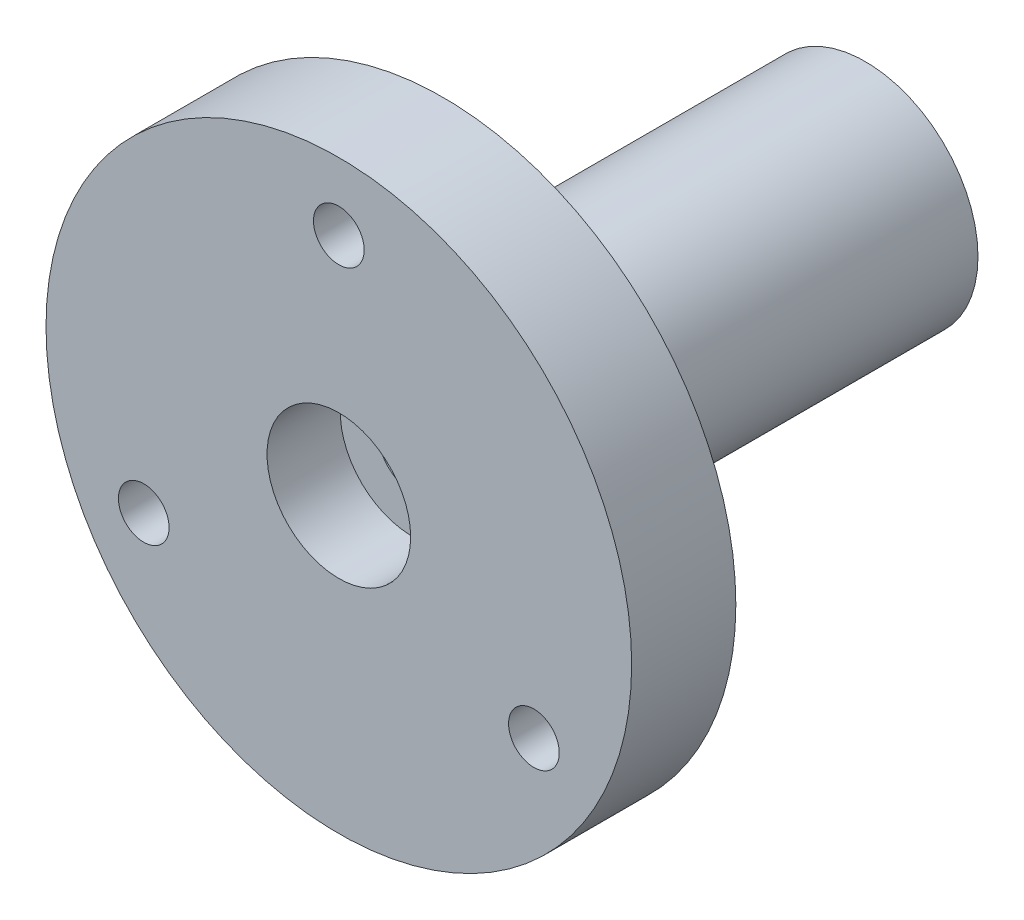
ISO-10303-21;
HEADER;
FILE_DESCRIPTION(('STEP AP214'),'2;1');
FILE_NAME('part.step','',(''),(''),'','','');
FILE_SCHEMA(('AUTOMOTIVE_DESIGN { 1 0 10303 214 1 1 1 1 }'));
ENDSEC;
DATA;
#1=APPLICATION_CONTEXT('core data for automotive mechanical design processes');
#2=APPLICATION_PROTOCOL_DEFINITION('international standard','automotive_design',2000,#1);
#3=PRODUCT_CONTEXT('',#1,'mechanical');
#4=PRODUCT('Part','Part','',(#3));
#5=PRODUCT_RELATED_PRODUCT_CATEGORY('part','',(#4));
#6=PRODUCT_DEFINITION_FORMATION('','',#4);
#7=PRODUCT_DEFINITION_CONTEXT('part definition',#1,'design');
#8=PRODUCT_DEFINITION('design','',#6,#7);
#9=PRODUCT_DEFINITION_SHAPE('','',#8);
#10=(LENGTH_UNIT() NAMED_UNIT(*) SI_UNIT(.MILLI.,.METRE.));
#11=(NAMED_UNIT(*) PLANE_ANGLE_UNIT() SI_UNIT($,.RADIAN.));
#12=(NAMED_UNIT(*) SI_UNIT($,.STERADIAN.) SOLID_ANGLE_UNIT());
#13=UNCERTAINTY_MEASURE_WITH_UNIT(LENGTH_MEASURE(1.E-05),#10,'distance_accuracy_value','');
#14=(GEOMETRIC_REPRESENTATION_CONTEXT(3) GLOBAL_UNCERTAINTY_ASSIGNED_CONTEXT((#13)) GLOBAL_UNIT_ASSIGNED_CONTEXT((#10,
#11,#12)) REPRESENTATION_CONTEXT('',''));
#15=CARTESIAN_POINT('',(0.,0.,0.));
#16=DIRECTION('',(0.,0.,1.));
#17=DIRECTION('',(1.,0.,0.));
#18=AXIS2_PLACEMENT_3D('',#15,#16,#17);
#19=CARTESIAN_POINT('',(0.,0.,3.7));
#20=DIRECTION('',(0.,0.,-1.));
#21=DIRECTION('',(-1.,0.,0.));
#22=AXIS2_PLACEMENT_3D('',#19,#20,#21);
#23=CYLINDRICAL_SURFACE('',#22,1.2);
#24=CARTESIAN_POINT('',(0.,0.,1.1));
#25=DIRECTION('',(0.,0.,1.));
#26=DIRECTION('',(1.,0.,0.));
#27=AXIS2_PLACEMENT_3D('',#24,#25,#26);
#28=CIRCLE('',#27,1.2);
#29=CARTESIAN_POINT('',(1.2,0.,1.1));
#30=VERTEX_POINT('',#29);
#31=EDGE_CURVE('E41',#30,#30,#28,.F.);
#32=ORIENTED_EDGE('',*,*,#31,.F.);
#33=EDGE_LOOP('',(#32));
#34=FACE_BOUND('',#33,.T.);
#35=CARTESIAN_POINT('',(0.,0.,-15.));
#36=DIRECTION('',(0.,0.,-1.));
#37=DIRECTION('',(-1.,0.,0.));
#38=AXIS2_PLACEMENT_3D('',#35,#36,#37);
#39=CIRCLE('',#38,1.2);
#40=CARTESIAN_POINT('',(-1.2,0.,-15.));
#41=VERTEX_POINT('',#40);
#42=EDGE_CURVE('E325',#41,#41,#39,.T.);
#43=ORIENTED_EDGE('',*,*,#42,.T.);
#44=EDGE_LOOP('',(#43));
#45=FACE_BOUND('',#44,.T.);
#46=ADVANCED_FACE('F37',(#34,#45),#23,.F.);
#47=CARTESIAN_POINT('',(6.92820323027555,-3.99999999999994,3.7));
#48=DIRECTION('',(0.,0.,-1.));
#49=DIRECTION('',(-1.,0.,0.));
#50=AXIS2_PLACEMENT_3D('',#47,#48,#49);
#51=CYLINDRICAL_SURFACE('',#50,0.9);
#52=CARTESIAN_POINT('',(6.92820323027555,-3.99999999999994,3.7));
#53=DIRECTION('',(0.,0.,-1.));
#54=DIRECTION('',(0.499999999999992,0.866025403784443,0.));
#55=AXIS2_PLACEMENT_3D('',#52,#53,#54);
#56=CIRCLE('',#55,0.9);
#57=CARTESIAN_POINT('',(7.37820323027554,-3.22057713659394,3.7));
#58=VERTEX_POINT('',#57);
#59=EDGE_CURVE('E79',#58,#58,#56,.T.);
#60=ORIENTED_EDGE('',*,*,#59,.F.);
#61=EDGE_LOOP('',(#60));
#62=FACE_BOUND('',#61,.T.);
#63=CARTESIAN_POINT('',(6.92820323027555,-3.99999999999994,1.5));
#64=DIRECTION('',(0.,0.,-1.));
#65=DIRECTION('',(-1.,0.,0.));
#66=AXIS2_PLACEMENT_3D('',#63,#64,#65);
#67=CIRCLE('',#66,0.9);
#68=CARTESIAN_POINT('',(6.02820323027555,-3.99999999999994,1.5));
#69=VERTEX_POINT('',#68);
#70=EDGE_CURVE('E82',#69,#69,#67,.F.);
#71=ORIENTED_EDGE('',*,*,#70,.F.);
#72=EDGE_LOOP('',(#71));
#73=FACE_BOUND('',#72,.T.);
#74=ADVANCED_FACE('F102',(#62,#73),#51,.F.);
#75=CARTESIAN_POINT('',(-6.92820323027549,-4.00000000000003,3.7));
#76=DIRECTION('',(0.,0.,-1.));
#77=DIRECTION('',(-1.,0.,0.));
#78=AXIS2_PLACEMENT_3D('',#75,#76,#77);
#79=CYLINDRICAL_SURFACE('',#78,0.9);
#80=CARTESIAN_POINT('',(-6.92820323027549,-4.00000000000003,3.7));
#81=DIRECTION('',(0.,0.,-1.));
#82=DIRECTION('',(0.500000000000004,-0.866025403784436,0.));
#83=AXIS2_PLACEMENT_3D('',#80,#81,#82);
#84=CIRCLE('',#83,0.9);
#85=CARTESIAN_POINT('',(-6.47820323027549,-4.77942286340603,3.7));
#86=VERTEX_POINT('',#85);
#87=EDGE_CURVE('E75',#86,#86,#84,.T.);
#88=ORIENTED_EDGE('',*,*,#87,.F.);
#89=EDGE_LOOP('',(#88));
#90=FACE_BOUND('',#89,.T.);
#91=CARTESIAN_POINT('',(-6.92820323027549,-4.00000000000003,1.5));
#92=DIRECTION('',(0.,0.,-1.));
#93=DIRECTION('',(-1.,0.,0.));
#94=AXIS2_PLACEMENT_3D('',#91,#92,#93);
#95=CIRCLE('',#94,0.9);
#96=CARTESIAN_POINT('',(-7.82820323027549,-4.00000000000003,1.5));
#97=VERTEX_POINT('',#96);
#98=EDGE_CURVE('E65',#97,#97,#95,.F.);
#99=ORIENTED_EDGE('',*,*,#98,.F.);
#100=EDGE_LOOP('',(#99));
#101=FACE_BOUND('',#100,.T.);
#102=ADVANCED_FACE('F104',(#90,#101),#79,.F.);
#103=CARTESIAN_POINT('',(0.,8.,3.7));
#104=DIRECTION('',(0.,0.,-1.));
#105=DIRECTION('',(-1.,0.,0.));
#106=AXIS2_PLACEMENT_3D('',#103,#104,#105);
#107=CYLINDRICAL_SURFACE('',#106,0.9);
#108=CARTESIAN_POINT('',(0.,8.,3.7));
#109=DIRECTION('',(0.,0.,-1.));
#110=DIRECTION('',(-1.,0.,0.));
#111=AXIS2_PLACEMENT_3D('',#108,#109,#110);
#112=CIRCLE('',#111,0.9);
#113=CARTESIAN_POINT('',(-0.9,8.,3.7));
#114=VERTEX_POINT('',#113);
#115=EDGE_CURVE('E89',#114,#114,#112,.T.);
#116=ORIENTED_EDGE('',*,*,#115,.F.);
#117=EDGE_LOOP('',(#116));
#118=FACE_BOUND('',#117,.T.);
#119=CARTESIAN_POINT('',(0.,8.,1.5));
#120=DIRECTION('',(0.,0.,-1.));
#121=DIRECTION('',(-1.,0.,0.));
#122=AXIS2_PLACEMENT_3D('',#119,#120,#121);
#123=CIRCLE('',#122,0.9);
#124=CARTESIAN_POINT('',(-0.9,8.,1.5));
#125=VERTEX_POINT('',#124);
#126=EDGE_CURVE('E86',#125,#125,#123,.F.);
#127=ORIENTED_EDGE('',*,*,#126,.F.);
#128=EDGE_LOOP('',(#127));
#129=FACE_BOUND('',#128,.T.);
#130=ADVANCED_FACE('F111',(#118,#129),#107,.F.);
#131=CARTESIAN_POINT('',(0.,0.,3.7));
#132=DIRECTION('',(0.,0.,-1.));
#133=DIRECTION('',(-1.,0.,0.));
#134=AXIS2_PLACEMENT_3D('',#131,#132,#133);
#135=CYLINDRICAL_SURFACE('',#134,10.4);
#136=CARTESIAN_POINT('',(0.,0.,3.7));
#137=DIRECTION('',(0.,0.,1.));
#138=DIRECTION('',(1.,0.,0.));
#139=AXIS2_PLACEMENT_3D('',#136,#137,#138);
#140=CIRCLE('',#139,10.4);
#141=CARTESIAN_POINT('',(10.4,0.,3.7));
#142=VERTEX_POINT('',#141);
#143=EDGE_CURVE('E45',#142,#142,#140,.T.);
#144=ORIENTED_EDGE('',*,*,#143,.F.);
#145=EDGE_LOOP('',(#144));
#146=FACE_BOUND('',#145,.T.);
#147=CARTESIAN_POINT('',(0.,0.,0.));
#148=DIRECTION('',(0.,0.,1.));
#149=DIRECTION('',(1.,0.,0.));
#150=AXIS2_PLACEMENT_3D('',#147,#148,#149);
#151=CIRCLE('',#150,10.4);
#152=CARTESIAN_POINT('',(10.4,0.,0.));
#153=VERTEX_POINT('',#152);
#154=EDGE_CURVE('E50',#153,#153,#151,.T.);
#155=ORIENTED_EDGE('',*,*,#154,.T.);
#156=EDGE_LOOP('',(#155));
#157=FACE_BOUND('',#156,.T.);
#158=ADVANCED_FACE('F39',(#146,#157),#135,.T.);
#159=CARTESIAN_POINT('',(0.,0.,3.7));
#160=DIRECTION('',(0.,0.,1.));
#161=DIRECTION('',(1.,0.,0.));
#162=AXIS2_PLACEMENT_3D('',#159,#160,#161);
#163=PLANE('',#162);
#164=CARTESIAN_POINT('',(0.,0.,3.7));
#165=DIRECTION('',(0.,0.,1.));
#166=DIRECTION('',(1.,0.,0.));
#167=AXIS2_PLACEMENT_3D('',#164,#165,#166);
#168=CIRCLE('',#167,2.55);
#169=CARTESIAN_POINT('',(2.55,0.,3.7));
#170=VERTEX_POINT('',#169);
#171=EDGE_CURVE('E59',#170,#170,#168,.T.);
#172=ORIENTED_EDGE('',*,*,#171,.F.);
#173=EDGE_LOOP('',(#172));
#174=FACE_BOUND('',#173,.T.);
#175=ORIENTED_EDGE('',*,*,#87,.T.);
#176=EDGE_LOOP('',(#175));
#177=FACE_BOUND('',#176,.T.);
#178=ORIENTED_EDGE('',*,*,#59,.T.);
#179=EDGE_LOOP('',(#178));
#180=FACE_BOUND('',#179,.T.);
#181=ORIENTED_EDGE('',*,*,#115,.T.);
#182=EDGE_LOOP('',(#181));
#183=FACE_BOUND('',#182,.T.);
#184=ORIENTED_EDGE('',*,*,#143,.T.);
#185=EDGE_LOOP('',(#184));
#186=FACE_BOUND('',#185,.T.);
#187=ADVANCED_FACE('F132',(#174,#177,#180,#183,#186),#163,.T.);
#188=CARTESIAN_POINT('',(0.,0.,0.));
#189=DIRECTION('',(0.,0.,1.));
#190=DIRECTION('',(1.,0.,0.));
#191=AXIS2_PLACEMENT_3D('',#188,#189,#190);
#192=PLANE('',#191);
#193=CARTESIAN_POINT('',(0.,0.,0.));
#194=DIRECTION('',(0.,0.,-1.));
#195=DIRECTION('',(-1.,0.,0.));
#196=AXIS2_PLACEMENT_3D('',#193,#194,#195);
#197=CIRCLE('',#196,4.);
#198=CARTESIAN_POINT('',(-4.,0.,0.));
#199=VERTEX_POINT('',#198);
#200=EDGE_CURVE('E10',#199,#199,#197,.T.);
#201=ORIENTED_EDGE('',*,*,#200,.F.);
#202=EDGE_LOOP('',(#201));
#203=FACE_BOUND('',#202,.T.);
#204=CARTESIAN_POINT('',(-6.92820323027549,-4.00000000000003,0.));
#205=DIRECTION('',(0.,0.,-1.));
#206=DIRECTION('',(0.500000000000004,-0.866025403784436,0.));
#207=AXIS2_PLACEMENT_3D('',#204,#205,#206);
#208=CIRCLE('',#207,1.5);
#209=CARTESIAN_POINT('',(-6.17820323027549,-5.29903810567669,0.));
#210=VERTEX_POINT('',#209);
#211=EDGE_CURVE('E66',#210,#210,#208,.T.);
#212=ORIENTED_EDGE('',*,*,#211,.F.);
#213=EDGE_LOOP('',(#212));
#214=FACE_BOUND('',#213,.T.);
#215=CARTESIAN_POINT('',(6.92820323027555,-3.99999999999994,0.));
#216=DIRECTION('',(0.,0.,-1.));
#217=DIRECTION('',(0.499999999999992,0.866025403784443,0.));
#218=AXIS2_PLACEMENT_3D('',#215,#216,#217);
#219=CIRCLE('',#218,1.5);
#220=CARTESIAN_POINT('',(7.67820323027553,-2.70096189432327,0.));
#221=VERTEX_POINT('',#220);
#222=EDGE_CURVE('E72',#221,#221,#219,.T.);
#223=ORIENTED_EDGE('',*,*,#222,.F.);
#224=EDGE_LOOP('',(#223));
#225=FACE_BOUND('',#224,.T.);
#226=CARTESIAN_POINT('',(0.,8.,0.));
#227=DIRECTION('',(0.,0.,-1.));
#228=DIRECTION('',(-1.,0.,0.));
#229=AXIS2_PLACEMENT_3D('',#226,#227,#228);
#230=CIRCLE('',#229,1.5);
#231=CARTESIAN_POINT('',(-1.5,8.,0.));
#232=VERTEX_POINT('',#231);
#233=EDGE_CURVE('E78',#232,#232,#230,.T.);
#234=ORIENTED_EDGE('',*,*,#233,.F.);
#235=EDGE_LOOP('',(#234));
#236=FACE_BOUND('',#235,.T.);
#237=ORIENTED_EDGE('',*,*,#154,.F.);
#238=EDGE_LOOP('',(#237));
#239=FACE_BOUND('',#238,.T.);
#240=ADVANCED_FACE('F123',(#203,#214,#225,#236,#239),#192,.F.);
#241=CARTESIAN_POINT('',(0.,8.,1.5));
#242=DIRECTION('',(0.,0.,-1.));
#243=DIRECTION('',(-1.,0.,0.));
#244=AXIS2_PLACEMENT_3D('',#241,#242,#243);
#245=PLANE('',#244);
#246=CARTESIAN_POINT('',(0.,8.,1.5));
#247=DIRECTION('',(0.,0.,-1.));
#248=DIRECTION('',(-1.,0.,0.));
#249=AXIS2_PLACEMENT_3D('',#246,#247,#248);
#250=CIRCLE('',#249,1.5);
#251=CARTESIAN_POINT('',(-1.5,8.,1.5));
#252=VERTEX_POINT('',#251);
#253=EDGE_CURVE('E83',#252,#252,#250,.T.);
#254=ORIENTED_EDGE('',*,*,#253,.T.);
#255=EDGE_LOOP('',(#254));
#256=FACE_BOUND('',#255,.T.);
#257=ORIENTED_EDGE('',*,*,#126,.T.);
#258=EDGE_LOOP('',(#257));
#259=FACE_BOUND('',#258,.T.);
#260=ADVANCED_FACE('F119',(#256,#259),#245,.T.);
#261=CARTESIAN_POINT('',(0.,8.,1.5));
#262=DIRECTION('',(0.,0.,-1.));
#263=DIRECTION('',(-1.,0.,0.));
#264=AXIS2_PLACEMENT_3D('',#261,#262,#263);
#265=CYLINDRICAL_SURFACE('',#264,1.5);
#266=ORIENTED_EDGE('',*,*,#253,.F.);
#267=EDGE_LOOP('',(#266));
#268=FACE_BOUND('',#267,.T.);
#269=ORIENTED_EDGE('',*,*,#233,.T.);
#270=EDGE_LOOP('',(#269));
#271=FACE_BOUND('',#270,.T.);
#272=ADVANCED_FACE('F122',(#268,#271),#265,.F.);
#273=CARTESIAN_POINT('',(-6.92820323027549,-4.00000000000003,1.5));
#274=DIRECTION('',(0.,0.,-1.));
#275=DIRECTION('',(0.500000000000004,-0.866025403784436,0.));
#276=AXIS2_PLACEMENT_3D('',#273,#274,#275);
#277=PLANE('',#276);
#278=CARTESIAN_POINT('',(-6.92820323027549,-4.00000000000003,1.5));
#279=DIRECTION('',(0.,0.,-1.));
#280=DIRECTION('',(0.500000000000004,-0.866025403784436,0.));
#281=AXIS2_PLACEMENT_3D('',#278,#279,#280);
#282=CIRCLE('',#281,1.5);
#283=CARTESIAN_POINT('',(-6.17820323027549,-5.29903810567669,1.5));
#284=VERTEX_POINT('',#283);
#285=EDGE_CURVE('E62',#284,#284,#282,.T.);
#286=ORIENTED_EDGE('',*,*,#285,.T.);
#287=EDGE_LOOP('',(#286));
#288=FACE_BOUND('',#287,.T.);
#289=ORIENTED_EDGE('',*,*,#98,.T.);
#290=EDGE_LOOP('',(#289));
#291=FACE_BOUND('',#290,.T.);
#292=ADVANCED_FACE('F127',(#288,#291),#277,.T.);
#293=CARTESIAN_POINT('',(-6.92820323027549,-4.00000000000003,1.5));
#294=DIRECTION('',(0.,0.,-1.));
#295=DIRECTION('',(-1.,0.,0.));
#296=AXIS2_PLACEMENT_3D('',#293,#294,#295);
#297=CYLINDRICAL_SURFACE('',#296,1.5);
#298=ORIENTED_EDGE('',*,*,#285,.F.);
#299=EDGE_LOOP('',(#298));
#300=FACE_BOUND('',#299,.T.);
#301=ORIENTED_EDGE('',*,*,#211,.T.);
#302=EDGE_LOOP('',(#301));
#303=FACE_BOUND('',#302,.T.);
#304=ADVANCED_FACE('F246',(#300,#303),#297,.F.);
#305=CARTESIAN_POINT('',(6.92820323027555,-3.99999999999994,1.5));
#306=DIRECTION('',(0.,0.,-1.));
#307=DIRECTION('',(0.499999999999992,0.866025403784443,0.));
#308=AXIS2_PLACEMENT_3D('',#305,#306,#307);
#309=PLANE('',#308);
#310=CARTESIAN_POINT('',(6.92820323027555,-3.99999999999994,1.5));
#311=DIRECTION('',(0.,0.,-1.));
#312=DIRECTION('',(0.499999999999992,0.866025403784443,0.));
#313=AXIS2_PLACEMENT_3D('',#310,#311,#312);
#314=CIRCLE('',#313,1.5);
#315=CARTESIAN_POINT('',(7.67820323027553,-2.70096189432327,1.5));
#316=VERTEX_POINT('',#315);
#317=EDGE_CURVE('E69',#316,#316,#314,.T.);
#318=ORIENTED_EDGE('',*,*,#317,.T.);
#319=EDGE_LOOP('',(#318));
#320=FACE_BOUND('',#319,.T.);
#321=ORIENTED_EDGE('',*,*,#70,.T.);
#322=EDGE_LOOP('',(#321));
#323=FACE_BOUND('',#322,.T.);
#324=ADVANCED_FACE('F100',(#320,#323),#309,.T.);
#325=CARTESIAN_POINT('',(6.92820323027555,-3.99999999999994,1.5));
#326=DIRECTION('',(0.,0.,-1.));
#327=DIRECTION('',(-1.,0.,0.));
#328=AXIS2_PLACEMENT_3D('',#325,#326,#327);
#329=CYLINDRICAL_SURFACE('',#328,1.5);
#330=ORIENTED_EDGE('',*,*,#317,.F.);
#331=EDGE_LOOP('',(#330));
#332=FACE_BOUND('',#331,.T.);
#333=ORIENTED_EDGE('',*,*,#222,.T.);
#334=EDGE_LOOP('',(#333));
#335=FACE_BOUND('',#334,.T.);
#336=ADVANCED_FACE('F168',(#332,#335),#329,.F.);
#337=CARTESIAN_POINT('',(0.,0.,1.1));
#338=DIRECTION('',(0.,0.,1.));
#339=DIRECTION('',(1.,0.,0.));
#340=AXIS2_PLACEMENT_3D('',#337,#338,#339);
#341=PLANE('',#340);
#342=CARTESIAN_POINT('',(0.,0.,1.1));
#343=DIRECTION('',(0.,0.,1.));
#344=DIRECTION('',(1.,0.,0.));
#345=AXIS2_PLACEMENT_3D('',#342,#343,#344);
#346=CIRCLE('',#345,2.55);
#347=CARTESIAN_POINT('',(2.55,0.,1.1));
#348=VERTEX_POINT('',#347);
#349=EDGE_CURVE('E56',#348,#348,#346,.T.);
#350=ORIENTED_EDGE('',*,*,#349,.T.);
#351=EDGE_LOOP('',(#350));
#352=FACE_BOUND('',#351,.T.);
#353=ORIENTED_EDGE('',*,*,#31,.T.);
#354=EDGE_LOOP('',(#353));
#355=FACE_BOUND('',#354,.T.);
#356=ADVANCED_FACE('F173',(#352,#355),#341,.T.);
#357=CARTESIAN_POINT('',(0.,0.,1.1));
#358=DIRECTION('',(0.,0.,1.));
#359=DIRECTION('',(1.,0.,0.));
#360=AXIS2_PLACEMENT_3D('',#357,#358,#359);
#361=CYLINDRICAL_SURFACE('',#360,2.55);
#362=ORIENTED_EDGE('',*,*,#349,.F.);
#363=EDGE_LOOP('',(#362));
#364=FACE_BOUND('',#363,.T.);
#365=ORIENTED_EDGE('',*,*,#171,.T.);
#366=EDGE_LOOP('',(#365));
#367=FACE_BOUND('',#366,.T.);
#368=ADVANCED_FACE('F178',(#364,#367),#361,.F.);
#369=CARTESIAN_POINT('',(0.,0.,-15.));
#370=DIRECTION('',(0.,0.,-1.));
#371=DIRECTION('',(-1.,0.,0.));
#372=AXIS2_PLACEMENT_3D('',#369,#370,#371);
#373=PLANE('',#372);
#374=CARTESIAN_POINT('',(0.,0.,-15.));
#375=DIRECTION('',(0.,0.,-1.));
#376=DIRECTION('',(-1.,0.,0.));
#377=AXIS2_PLACEMENT_3D('',#374,#375,#376);
#378=CIRCLE('',#377,4.);
#379=CARTESIAN_POINT('',(-4.,0.,-15.));
#380=VERTEX_POINT('',#379);
#381=EDGE_CURVE('E54',#380,#380,#378,.T.);
#382=ORIENTED_EDGE('',*,*,#381,.T.);
#383=EDGE_LOOP('',(#382));
#384=FACE_BOUND('',#383,.T.);
#385=ORIENTED_EDGE('',*,*,#42,.F.);
#386=EDGE_LOOP('',(#385));
#387=FACE_BOUND('',#386,.T.);
#388=ADVANCED_FACE('F190',(#384,#387),#373,.T.);
#389=CARTESIAN_POINT('',(0.,0.,-15.));
#390=DIRECTION('',(0.,0.,1.));
#391=DIRECTION('',(1.,0.,0.));
#392=AXIS2_PLACEMENT_3D('',#389,#390,#391);
#393=CYLINDRICAL_SURFACE('',#392,4.);
#394=ORIENTED_EDGE('',*,*,#381,.F.);
#395=EDGE_LOOP('',(#394));
#396=FACE_BOUND('',#395,.T.);
#397=ORIENTED_EDGE('',*,*,#200,.T.);
#398=EDGE_LOOP('',(#397));
#399=FACE_BOUND('',#398,.T.);
#400=ADVANCED_FACE('F213',(#396,#399),#393,.T.);
#401=CLOSED_SHELL('',(#46,#74,#102,#130,#158,#187,#240,#260,#272,#292,#304,#324,#336,#356,#368,
#388,#400));
#402=MANIFOLD_SOLID_BREP('B2',#401);
#403=ADVANCED_BREP_SHAPE_REPRESENTATION('',(#18,#402),#14);
#404=SHAPE_DEFINITION_REPRESENTATION(#9,#403);
ENDSEC;
END-ISO-10303-21;
